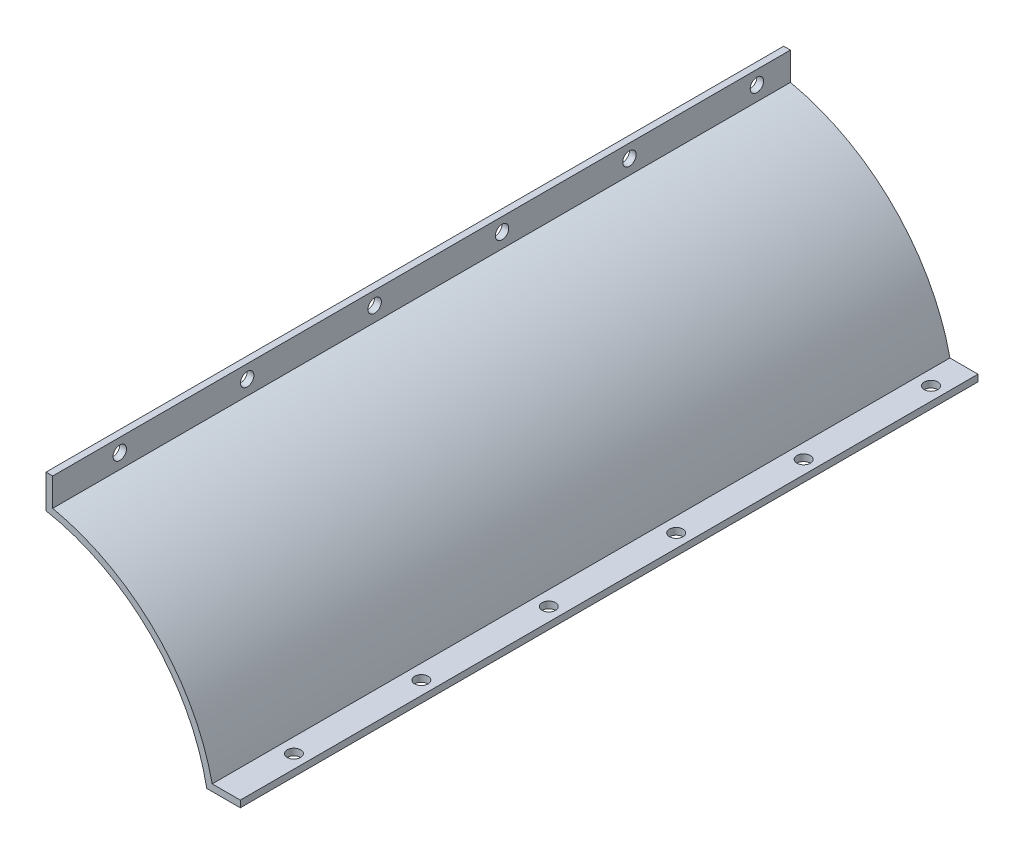
ISO-10303-21;
HEADER;
FILE_DESCRIPTION(('STEP AP214'),'2;1');
FILE_NAME('part.step','',(''),(''),'','','');
FILE_SCHEMA(('AUTOMOTIVE_DESIGN { 1 0 10303 214 1 1 1 1 }'));
ENDSEC;
DATA;
#1=APPLICATION_CONTEXT('core data for automotive mechanical design processes');
#2=APPLICATION_PROTOCOL_DEFINITION('international standard','automotive_design',2000,#1);
#3=PRODUCT_CONTEXT('',#1,'mechanical');
#4=PRODUCT('Part','Part','',(#3));
#5=PRODUCT_RELATED_PRODUCT_CATEGORY('part','',(#4));
#6=PRODUCT_DEFINITION_FORMATION('','',#4);
#7=PRODUCT_DEFINITION_CONTEXT('part definition',#1,'design');
#8=PRODUCT_DEFINITION('design','',#6,#7);
#9=PRODUCT_DEFINITION_SHAPE('','',#8);
#10=(LENGTH_UNIT() NAMED_UNIT(*) SI_UNIT(.MILLI.,.METRE.));
#11=(NAMED_UNIT(*) PLANE_ANGLE_UNIT() SI_UNIT($,.RADIAN.));
#12=(NAMED_UNIT(*) SI_UNIT($,.STERADIAN.) SOLID_ANGLE_UNIT());
#13=UNCERTAINTY_MEASURE_WITH_UNIT(LENGTH_MEASURE(1.E-05),#10,'distance_accuracy_value','');
#14=(GEOMETRIC_REPRESENTATION_CONTEXT(3) GLOBAL_UNCERTAINTY_ASSIGNED_CONTEXT((#13)) GLOBAL_UNIT_ASSIGNED_CONTEXT((#10,
#11,#12)) REPRESENTATION_CONTEXT('',''));
#15=CARTESIAN_POINT('',(0.,0.,0.));
#16=DIRECTION('',(0.,0.,1.));
#17=DIRECTION('',(1.,0.,0.));
#18=AXIS2_PLACEMENT_3D('',#15,#16,#17);
#19=CARTESIAN_POINT('',(0.,16.8155602251023,279.4));
#20=DIRECTION('',(0.,1.,0.));
#21=DIRECTION('',(-1.,0.,0.));
#22=AXIS2_PLACEMENT_3D('',#19,#20,#21);
#23=PLANE('',#22);
#24=CARTESIAN_POINT('',(82.4708408787736,16.8155602251023,12.7));
#25=DIRECTION('',(0.,1.,0.));
#26=DIRECTION('',(-1.,0.,0.));
#27=AXIS2_PLACEMENT_3D('',#24,#25,#26);
#28=CIRCLE('',#27,2.54);
#29=CARTESIAN_POINT('',(79.9308408787736,16.8155602251023,12.7));
#30=VERTEX_POINT('',#29);
#31=EDGE_CURVE('E246',#30,#30,#28,.T.);
#32=ORIENTED_EDGE('',*,*,#31,.F.);
#33=EDGE_LOOP('',(#32));
#34=FACE_BOUND('',#33,.T.);
#35=CARTESIAN_POINT('',(82.4708408787734,16.8155602251023,60.96));
#36=DIRECTION('',(0.,1.,0.));
#37=DIRECTION('',(-1.,0.,0.));
#38=AXIS2_PLACEMENT_3D('',#35,#36,#37);
#39=CIRCLE('',#38,2.54);
#40=CARTESIAN_POINT('',(79.9308408787734,16.8155602251023,60.96));
#41=VERTEX_POINT('',#40);
#42=EDGE_CURVE('E250',#41,#41,#39,.T.);
#43=ORIENTED_EDGE('',*,*,#42,.F.);
#44=EDGE_LOOP('',(#43));
#45=FACE_BOUND('',#44,.T.);
#46=CARTESIAN_POINT('',(82.4708408787732,16.8155602251023,109.22));
#47=DIRECTION('',(0.,1.,0.));
#48=DIRECTION('',(-1.,0.,0.));
#49=AXIS2_PLACEMENT_3D('',#46,#47,#48);
#50=CIRCLE('',#49,2.53999999999999);
#51=CARTESIAN_POINT('',(79.9308408787732,16.8155602251023,109.22));
#52=VERTEX_POINT('',#51);
#53=EDGE_CURVE('E254',#52,#52,#50,.T.);
#54=ORIENTED_EDGE('',*,*,#53,.F.);
#55=EDGE_LOOP('',(#54));
#56=FACE_BOUND('',#55,.T.);
#57=CARTESIAN_POINT('',(82.4708408787731,16.8155602251023,157.48));
#58=DIRECTION('',(0.,1.,0.));
#59=DIRECTION('',(-1.,0.,0.));
#60=AXIS2_PLACEMENT_3D('',#57,#58,#59);
#61=CIRCLE('',#60,2.54);
#62=CARTESIAN_POINT('',(79.9308408787731,16.8155602251023,157.48));
#63=VERTEX_POINT('',#62);
#64=EDGE_CURVE('E258',#63,#63,#61,.T.);
#65=ORIENTED_EDGE('',*,*,#64,.F.);
#66=EDGE_LOOP('',(#65));
#67=FACE_BOUND('',#66,.T.);
#68=CARTESIAN_POINT('',(82.4708408787729,16.8155602251023,205.74));
#69=DIRECTION('',(0.,1.,0.));
#70=DIRECTION('',(-1.,0.,0.));
#71=AXIS2_PLACEMENT_3D('',#68,#69,#70);
#72=CIRCLE('',#71,2.54);
#73=CARTESIAN_POINT('',(79.9308408787729,16.8155602251023,205.74));
#74=VERTEX_POINT('',#73);
#75=EDGE_CURVE('E262',#74,#74,#72,.T.);
#76=ORIENTED_EDGE('',*,*,#75,.F.);
#77=EDGE_LOOP('',(#76));
#78=FACE_BOUND('',#77,.T.);
#79=CARTESIAN_POINT('',(82.4708408787727,16.8155602251023,254.));
#80=DIRECTION('',(0.,1.,0.));
#81=DIRECTION('',(-1.,0.,0.));
#82=AXIS2_PLACEMENT_3D('',#79,#80,#81);
#83=CIRCLE('',#82,2.53999999999998);
#84=CARTESIAN_POINT('',(79.9308408787727,16.8155602251023,254.));
#85=VERTEX_POINT('',#84);
#86=EDGE_CURVE('E265',#85,#85,#83,.T.);
#87=ORIENTED_EDGE('',*,*,#86,.F.);
#88=EDGE_LOOP('',(#87));
#89=FACE_BOUND('',#88,.T.);
#90=DIRECTION('',(1.,0.,0.));
#91=VECTOR('',#90,1.);
#92=CARTESIAN_POINT('',(0.,16.8155602251023,0.));
#93=LINE('',#92,#91);
#94=CARTESIAN_POINT('',(76.9234979334401,16.8155602251023,0.));
#95=VERTEX_POINT('',#94);
#96=CARTESIAN_POINT('',(87.5508408787736,16.8155602251023,0.));
#97=VERTEX_POINT('',#96);
#98=EDGE_CURVE('E148',#95,#97,#93,.T.);
#99=ORIENTED_EDGE('',*,*,#98,.F.);
#100=DIRECTION('',(0.,0.,-1.));
#101=VECTOR('',#100,1.);
#102=CARTESIAN_POINT('',(76.9234979334401,16.8155602251023,279.4));
#103=LINE('',#102,#101);
#104=CARTESIAN_POINT('',(76.9234979334401,16.8155602251023,279.4));
#105=VERTEX_POINT('',#104);
#106=EDGE_CURVE('E11',#105,#95,#103,.T.);
#107=ORIENTED_EDGE('',*,*,#106,.F.);
#108=DIRECTION('',(1.,0.,0.));
#109=VECTOR('',#108,1.);
#110=CARTESIAN_POINT('',(0.,16.8155602251023,279.4));
#111=LINE('',#110,#109);
#112=CARTESIAN_POINT('',(87.5508408787736,16.8155602251023,279.4));
#113=VERTEX_POINT('',#112);
#114=EDGE_CURVE('E175',#105,#113,#111,.T.);
#115=ORIENTED_EDGE('',*,*,#114,.T.);
#116=DIRECTION('',(0.,0.,-1.));
#117=VECTOR('',#116,1.);
#118=CARTESIAN_POINT('',(87.5508408787736,16.8155602251023,279.4));
#119=LINE('',#118,#117);
#120=EDGE_CURVE('E64',#113,#97,#119,.T.);
#121=ORIENTED_EDGE('',*,*,#120,.T.);
#122=EDGE_LOOP('',(#99,#107,#115,#121));
#123=FACE_BOUND('',#122,.T.);
#124=ADVANCED_FACE('F45',(#34,#45,#56,#67,#78,#89,#123),#23,.T.);
#125=CARTESIAN_POINT('',(0.,0.,279.4));
#126=DIRECTION('',(0.,0.,-1.));
#127=DIRECTION('',(-1.,0.,0.));
#128=AXIS2_PLACEMENT_3D('',#125,#126,#127);
#129=CYLINDRICAL_SURFACE('',#128,78.74);
#130=CARTESIAN_POINT('',(0.,0.,0.));
#131=DIRECTION('',(0.,0.,1.));
#132=DIRECTION('',(1.,0.,0.));
#133=AXIS2_PLACEMENT_3D('',#130,#131,#132);
#134=CIRCLE('',#133,78.74);
#135=CARTESIAN_POINT('',(16.51,76.9896583964366,0.));
#136=VERTEX_POINT('',#135);
#137=EDGE_CURVE('E151',#95,#136,#134,.T.);
#138=ORIENTED_EDGE('',*,*,#137,.T.);
#139=DIRECTION('',(0.,0.,-1.));
#140=VECTOR('',#139,1.);
#141=CARTESIAN_POINT('',(16.51,76.9896583964366,279.4));
#142=LINE('',#141,#140);
#143=CARTESIAN_POINT('',(16.51,76.9896583964366,279.4));
#144=VERTEX_POINT('',#143);
#145=EDGE_CURVE('E55',#144,#136,#142,.T.);
#146=ORIENTED_EDGE('',*,*,#145,.F.);
#147=CARTESIAN_POINT('',(0.,0.,279.4));
#148=DIRECTION('',(0.,0.,1.));
#149=DIRECTION('',(1.,0.,0.));
#150=AXIS2_PLACEMENT_3D('',#147,#148,#149);
#151=CIRCLE('',#150,78.74);
#152=EDGE_CURVE('E326',#105,#144,#151,.T.);
#153=ORIENTED_EDGE('',*,*,#152,.F.);
#154=ORIENTED_EDGE('',*,*,#106,.T.);
#155=EDGE_LOOP('',(#138,#146,#153,#154));
#156=FACE_BOUND('',#155,.T.);
#157=ADVANCED_FACE('F236',(#156),#129,.T.);
#158=CARTESIAN_POINT('',(16.51,0.,279.4));
#159=DIRECTION('',(1.,0.,0.));
#160=DIRECTION('',(0.,0.,-1.));
#161=AXIS2_PLACEMENT_3D('',#158,#159,#160);
#162=PLANE('',#161);
#163=CARTESIAN_POINT('',(16.51,82.5284714835378,12.7));
#164=DIRECTION('',(1.,0.,0.));
#165=DIRECTION('',(0.,0.,-1.));
#166=AXIS2_PLACEMENT_3D('',#163,#164,#165);
#167=CIRCLE('',#166,2.53999999999999);
#168=CARTESIAN_POINT('',(16.51,82.5284714835378,10.16));
#169=VERTEX_POINT('',#168);
#170=EDGE_CURVE('E196',#169,#169,#167,.T.);
#171=ORIENTED_EDGE('',*,*,#170,.F.);
#172=EDGE_LOOP('',(#171));
#173=FACE_BOUND('',#172,.T.);
#174=CARTESIAN_POINT('',(16.51,82.5284714835375,60.96));
#175=DIRECTION('',(1.,0.,0.));
#176=DIRECTION('',(0.,0.,-1.));
#177=AXIS2_PLACEMENT_3D('',#174,#175,#176);
#178=CIRCLE('',#177,2.53999999999999);
#179=CARTESIAN_POINT('',(16.51,82.5284714835375,58.42));
#180=VERTEX_POINT('',#179);
#181=EDGE_CURVE('E298',#180,#180,#178,.T.);
#182=ORIENTED_EDGE('',*,*,#181,.F.);
#183=EDGE_LOOP('',(#182));
#184=FACE_BOUND('',#183,.T.);
#185=CARTESIAN_POINT('',(16.51,82.5284714835372,109.22));
#186=DIRECTION('',(1.,0.,0.));
#187=DIRECTION('',(0.,0.,-1.));
#188=AXIS2_PLACEMENT_3D('',#185,#186,#187);
#189=CIRCLE('',#188,2.53999999999999);
#190=CARTESIAN_POINT('',(16.51,82.5284714835372,106.68));
#191=VERTEX_POINT('',#190);
#192=EDGE_CURVE('E302',#191,#191,#189,.T.);
#193=ORIENTED_EDGE('',*,*,#192,.F.);
#194=EDGE_LOOP('',(#193));
#195=FACE_BOUND('',#194,.T.);
#196=CARTESIAN_POINT('',(16.51,82.5284714835368,157.48));
#197=DIRECTION('',(1.,0.,0.));
#198=DIRECTION('',(0.,0.,-1.));
#199=AXIS2_PLACEMENT_3D('',#196,#197,#198);
#200=CIRCLE('',#199,2.53999999999998);
#201=CARTESIAN_POINT('',(16.51,82.5284714835368,154.94));
#202=VERTEX_POINT('',#201);
#203=EDGE_CURVE('E306',#202,#202,#200,.T.);
#204=ORIENTED_EDGE('',*,*,#203,.F.);
#205=EDGE_LOOP('',(#204));
#206=FACE_BOUND('',#205,.T.);
#207=CARTESIAN_POINT('',(16.51,82.5284714835365,205.74));
#208=DIRECTION('',(1.,0.,0.));
#209=DIRECTION('',(0.,0.,-1.));
#210=AXIS2_PLACEMENT_3D('',#207,#208,#209);
#211=CIRCLE('',#210,2.53999999999998);
#212=CARTESIAN_POINT('',(16.51,82.5284714835365,203.2));
#213=VERTEX_POINT('',#212);
#214=EDGE_CURVE('E310',#213,#213,#211,.T.);
#215=ORIENTED_EDGE('',*,*,#214,.F.);
#216=EDGE_LOOP('',(#215));
#217=FACE_BOUND('',#216,.T.);
#218=CARTESIAN_POINT('',(16.51,82.5284714835362,254.));
#219=DIRECTION('',(1.,0.,0.));
#220=DIRECTION('',(0.,0.,-1.));
#221=AXIS2_PLACEMENT_3D('',#218,#219,#220);
#222=CIRCLE('',#221,2.54000000000001);
#223=CARTESIAN_POINT('',(16.51,82.5284714835362,251.46));
#224=VERTEX_POINT('',#223);
#225=EDGE_CURVE('E314',#224,#224,#222,.T.);
#226=ORIENTED_EDGE('',*,*,#225,.F.);
#227=EDGE_LOOP('',(#226));
#228=FACE_BOUND('',#227,.T.);
#229=DIRECTION('',(0.,-1.,0.));
#230=VECTOR('',#229,1.);
#231=CARTESIAN_POINT('',(16.51,0.,0.));
#232=LINE('',#231,#230);
#233=CARTESIAN_POINT('',(16.51,87.6084714835378,0.));
#234=VERTEX_POINT('',#233);
#235=EDGE_CURVE('E155',#234,#136,#232,.T.);
#236=ORIENTED_EDGE('',*,*,#235,.F.);
#237=DIRECTION('',(0.,0.,-1.));
#238=VECTOR('',#237,1.);
#239=CARTESIAN_POINT('',(16.51,87.6084714835378,279.4));
#240=LINE('',#239,#238);
#241=CARTESIAN_POINT('',(16.51,87.6084714835378,279.4));
#242=VERTEX_POINT('',#241);
#243=EDGE_CURVE('E186',#242,#234,#240,.T.);
#244=ORIENTED_EDGE('',*,*,#243,.F.);
#245=DIRECTION('',(0.,-1.,0.));
#246=VECTOR('',#245,1.);
#247=CARTESIAN_POINT('',(16.51,0.,279.4));
#248=LINE('',#247,#246);
#249=EDGE_CURVE('E325',#242,#144,#248,.T.);
#250=ORIENTED_EDGE('',*,*,#249,.T.);
#251=ORIENTED_EDGE('',*,*,#145,.T.);
#252=EDGE_LOOP('',(#236,#244,#250,#251));
#253=FACE_BOUND('',#252,.T.);
#254=ADVANCED_FACE('F241',(#173,#184,#195,#206,#217,#228,#253),#162,.T.);
#255=CARTESIAN_POINT('',(0.,87.6084714835378,279.4));
#256=DIRECTION('',(0.,-1.,0.));
#257=DIRECTION('',(0.,0.,-1.));
#258=AXIS2_PLACEMENT_3D('',#255,#256,#257);
#259=PLANE('',#258);
#260=DIRECTION('',(-1.,0.,0.));
#261=VECTOR('',#260,1.);
#262=CARTESIAN_POINT('',(0.,87.6084714835378,0.));
#263=LINE('',#262,#261);
#264=CARTESIAN_POINT('',(13.97,87.6084714835378,0.));
#265=VERTEX_POINT('',#264);
#266=EDGE_CURVE('E159',#234,#265,#263,.T.);
#267=ORIENTED_EDGE('',*,*,#266,.T.);
#268=DIRECTION('',(0.,0.,-1.));
#269=VECTOR('',#268,1.);
#270=CARTESIAN_POINT('',(13.97,87.6084714835378,279.4));
#271=LINE('',#270,#269);
#272=CARTESIAN_POINT('',(13.97,87.6084714835378,279.4));
#273=VERTEX_POINT('',#272);
#274=EDGE_CURVE('E182',#273,#265,#271,.T.);
#275=ORIENTED_EDGE('',*,*,#274,.F.);
#276=DIRECTION('',(-1.,0.,0.));
#277=VECTOR('',#276,1.);
#278=CARTESIAN_POINT('',(0.,87.6084714835378,279.4));
#279=LINE('',#278,#277);
#280=EDGE_CURVE('E142',#242,#273,#279,.T.);
#281=ORIENTED_EDGE('',*,*,#280,.F.);
#282=ORIENTED_EDGE('',*,*,#243,.T.);
#283=EDGE_LOOP('',(#267,#275,#281,#282));
#284=FACE_BOUND('',#283,.T.);
#285=ADVANCED_FACE('F285',(#284),#259,.F.);
#286=CARTESIAN_POINT('',(13.97,0.,279.4));
#287=DIRECTION('',(1.,0.,0.));
#288=DIRECTION('',(0.,0.,-1.));
#289=AXIS2_PLACEMENT_3D('',#286,#287,#288);
#290=PLANE('',#289);
#291=CARTESIAN_POINT('',(13.97,82.5284714835378,12.7));
#292=DIRECTION('',(1.,0.,0.));
#293=DIRECTION('',(0.,0.,-1.));
#294=AXIS2_PLACEMENT_3D('',#291,#292,#293);
#295=CIRCLE('',#294,2.53999999999999);
#296=CARTESIAN_POINT('',(13.97,82.5284714835378,10.16));
#297=VERTEX_POINT('',#296);
#298=EDGE_CURVE('E48',#297,#297,#295,.T.);
#299=ORIENTED_EDGE('',*,*,#298,.T.);
#300=EDGE_LOOP('',(#299));
#301=FACE_BOUND('',#300,.T.);
#302=CARTESIAN_POINT('',(13.97,82.5284714835375,60.96));
#303=DIRECTION('',(1.,0.,0.));
#304=DIRECTION('',(0.,0.,-1.));
#305=AXIS2_PLACEMENT_3D('',#302,#303,#304);
#306=CIRCLE('',#305,2.53999999999999);
#307=CARTESIAN_POINT('',(13.97,82.5284714835375,58.42));
#308=VERTEX_POINT('',#307);
#309=EDGE_CURVE('E207',#308,#308,#306,.T.);
#310=ORIENTED_EDGE('',*,*,#309,.T.);
#311=EDGE_LOOP('',(#310));
#312=FACE_BOUND('',#311,.T.);
#313=CARTESIAN_POINT('',(13.97,82.5284714835372,109.22));
#314=DIRECTION('',(1.,0.,0.));
#315=DIRECTION('',(0.,0.,-1.));
#316=AXIS2_PLACEMENT_3D('',#313,#314,#315);
#317=CIRCLE('',#316,2.53999999999999);
#318=CARTESIAN_POINT('',(13.97,82.5284714835372,106.68));
#319=VERTEX_POINT('',#318);
#320=EDGE_CURVE('E204',#319,#319,#317,.T.);
#321=ORIENTED_EDGE('',*,*,#320,.T.);
#322=EDGE_LOOP('',(#321));
#323=FACE_BOUND('',#322,.T.);
#324=CARTESIAN_POINT('',(13.97,82.5284714835368,157.48));
#325=DIRECTION('',(1.,0.,0.));
#326=DIRECTION('',(0.,0.,-1.));
#327=AXIS2_PLACEMENT_3D('',#324,#325,#326);
#328=CIRCLE('',#327,2.53999999999998);
#329=CARTESIAN_POINT('',(13.97,82.5284714835368,154.94));
#330=VERTEX_POINT('',#329);
#331=EDGE_CURVE('E200',#330,#330,#328,.T.);
#332=ORIENTED_EDGE('',*,*,#331,.T.);
#333=EDGE_LOOP('',(#332));
#334=FACE_BOUND('',#333,.T.);
#335=CARTESIAN_POINT('',(13.97,82.5284714835365,205.74));
#336=DIRECTION('',(1.,0.,0.));
#337=DIRECTION('',(0.,0.,-1.));
#338=AXIS2_PLACEMENT_3D('',#335,#336,#337);
#339=CIRCLE('',#338,2.53999999999998);
#340=CARTESIAN_POINT('',(13.97,82.5284714835365,203.2));
#341=VERTEX_POINT('',#340);
#342=EDGE_CURVE('E195',#341,#341,#339,.T.);
#343=ORIENTED_EDGE('',*,*,#342,.T.);
#344=EDGE_LOOP('',(#343));
#345=FACE_BOUND('',#344,.T.);
#346=CARTESIAN_POINT('',(13.97,82.5284714835362,254.));
#347=DIRECTION('',(1.,0.,0.));
#348=DIRECTION('',(0.,0.,-1.));
#349=AXIS2_PLACEMENT_3D('',#346,#347,#348);
#350=CIRCLE('',#349,2.54000000000001);
#351=CARTESIAN_POINT('',(13.97,82.5284714835362,251.46));
#352=VERTEX_POINT('',#351);
#353=EDGE_CURVE('E191',#352,#352,#350,.T.);
#354=ORIENTED_EDGE('',*,*,#353,.T.);
#355=EDGE_LOOP('',(#354));
#356=FACE_BOUND('',#355,.T.);
#357=DIRECTION('',(0.,-1.,0.));
#358=VECTOR('',#357,1.);
#359=CARTESIAN_POINT('',(13.97,0.,0.));
#360=LINE('',#359,#358);
#361=CARTESIAN_POINT('',(13.97,74.9084714835378,0.));
#362=VERTEX_POINT('',#361);
#363=EDGE_CURVE('E162',#265,#362,#360,.T.);
#364=ORIENTED_EDGE('',*,*,#363,.T.);
#365=DIRECTION('',(0.,0.,-1.));
#366=VECTOR('',#365,1.);
#367=CARTESIAN_POINT('',(13.97,74.9084714835378,279.4));
#368=LINE('',#367,#366);
#369=CARTESIAN_POINT('',(13.97,74.9084714835378,279.4));
#370=VERTEX_POINT('',#369);
#371=EDGE_CURVE('E125',#370,#362,#368,.T.);
#372=ORIENTED_EDGE('',*,*,#371,.F.);
#373=DIRECTION('',(0.,-1.,0.));
#374=VECTOR('',#373,1.);
#375=CARTESIAN_POINT('',(13.97,0.,279.4));
#376=LINE('',#375,#374);
#377=EDGE_CURVE('E137',#273,#370,#376,.T.);
#378=ORIENTED_EDGE('',*,*,#377,.F.);
#379=ORIENTED_EDGE('',*,*,#274,.T.);
#380=EDGE_LOOP('',(#364,#372,#378,#379));
#381=FACE_BOUND('',#380,.T.);
#382=ADVANCED_FACE('F216',(#301,#312,#323,#334,#345,#356,#381),#290,.F.);
#383=CARTESIAN_POINT('',(0.,0.,279.4));
#384=DIRECTION('',(0.,0.,-1.));
#385=DIRECTION('',(-1.,0.,0.));
#386=AXIS2_PLACEMENT_3D('',#383,#384,#385);
#387=CYLINDRICAL_SURFACE('',#386,76.2);
#388=CARTESIAN_POINT('',(0.,0.,0.));
#389=DIRECTION('',(0.,0.,1.));
#390=DIRECTION('',(1.,0.,0.));
#391=AXIS2_PLACEMENT_3D('',#388,#389,#390);
#392=CIRCLE('',#391,76.2);
#393=CARTESIAN_POINT('',(74.8508408787736,14.2755602251023,0.));
#394=VERTEX_POINT('',#393);
#395=EDGE_CURVE('E121',#394,#362,#392,.T.);
#396=ORIENTED_EDGE('',*,*,#395,.F.);
#397=DIRECTION('',(0.,0.,-1.));
#398=VECTOR('',#397,1.);
#399=CARTESIAN_POINT('',(74.8508408787736,14.2755602251023,279.4));
#400=LINE('',#399,#398);
#401=CARTESIAN_POINT('',(74.8508408787736,14.2755602251023,279.4));
#402=VERTEX_POINT('',#401);
#403=EDGE_CURVE('E115',#402,#394,#400,.T.);
#404=ORIENTED_EDGE('',*,*,#403,.F.);
#405=CARTESIAN_POINT('',(0.,0.,279.4));
#406=DIRECTION('',(0.,0.,1.));
#407=DIRECTION('',(1.,0.,0.));
#408=AXIS2_PLACEMENT_3D('',#405,#406,#407);
#409=CIRCLE('',#408,76.2);
#410=EDGE_CURVE('E119',#402,#370,#409,.T.);
#411=ORIENTED_EDGE('',*,*,#410,.T.);
#412=ORIENTED_EDGE('',*,*,#371,.T.);
#413=EDGE_LOOP('',(#396,#404,#411,#412));
#414=FACE_BOUND('',#413,.T.);
#415=ADVANCED_FACE('F117',(#414),#387,.F.);
#416=CARTESIAN_POINT('',(0.,14.2755602251023,279.4));
#417=DIRECTION('',(0.,1.,0.));
#418=DIRECTION('',(-1.,0.,0.));
#419=AXIS2_PLACEMENT_3D('',#416,#417,#418);
#420=PLANE('',#419);
#421=CARTESIAN_POINT('',(82.4708408787736,14.2755602251023,12.7));
#422=DIRECTION('',(0.,-1.,0.));
#423=DIRECTION('',(1.,0.,0.));
#424=AXIS2_PLACEMENT_3D('',#421,#422,#423);
#425=CIRCLE('',#424,2.54);
#426=CARTESIAN_POINT('',(85.0108408787736,14.2755602251023,12.7));
#427=VERTEX_POINT('',#426);
#428=EDGE_CURVE('E358',#427,#427,#425,.T.);
#429=ORIENTED_EDGE('',*,*,#428,.F.);
#430=EDGE_LOOP('',(#429));
#431=FACE_BOUND('',#430,.T.);
#432=CARTESIAN_POINT('',(82.4708408787734,14.2755602251023,60.96));
#433=DIRECTION('',(0.,-1.,0.));
#434=DIRECTION('',(1.,0.,0.));
#435=AXIS2_PLACEMENT_3D('',#432,#433,#434);
#436=CIRCLE('',#435,2.54);
#437=CARTESIAN_POINT('',(85.0108408787734,14.2755602251023,60.96));
#438=VERTEX_POINT('',#437);
#439=EDGE_CURVE('E375',#438,#438,#436,.T.);
#440=ORIENTED_EDGE('',*,*,#439,.F.);
#441=EDGE_LOOP('',(#440));
#442=FACE_BOUND('',#441,.T.);
#443=CARTESIAN_POINT('',(82.4708408787732,14.2755602251023,109.22));
#444=DIRECTION('',(0.,-1.,0.));
#445=DIRECTION('',(1.,0.,0.));
#446=AXIS2_PLACEMENT_3D('',#443,#444,#445);
#447=CIRCLE('',#446,2.53999999999999);
#448=CARTESIAN_POINT('',(85.0108408787732,14.2755602251023,109.22));
#449=VERTEX_POINT('',#448);
#450=EDGE_CURVE('E371',#449,#449,#447,.T.);
#451=ORIENTED_EDGE('',*,*,#450,.F.);
#452=EDGE_LOOP('',(#451));
#453=FACE_BOUND('',#452,.T.);
#454=CARTESIAN_POINT('',(82.4708408787731,14.2755602251023,157.48));
#455=DIRECTION('',(0.,-1.,0.));
#456=DIRECTION('',(1.,0.,0.));
#457=AXIS2_PLACEMENT_3D('',#454,#455,#456);
#458=CIRCLE('',#457,2.54);
#459=CARTESIAN_POINT('',(85.0108408787731,14.2755602251023,157.48));
#460=VERTEX_POINT('',#459);
#461=EDGE_CURVE('E367',#460,#460,#458,.T.);
#462=ORIENTED_EDGE('',*,*,#461,.F.);
#463=EDGE_LOOP('',(#462));
#464=FACE_BOUND('',#463,.T.);
#465=CARTESIAN_POINT('',(82.4708408787729,14.2755602251023,205.74));
#466=DIRECTION('',(0.,-1.,0.));
#467=DIRECTION('',(1.,0.,0.));
#468=AXIS2_PLACEMENT_3D('',#465,#466,#467);
#469=CIRCLE('',#468,2.54);
#470=CARTESIAN_POINT('',(85.0108408787729,14.2755602251023,205.74));
#471=VERTEX_POINT('',#470);
#472=EDGE_CURVE('E363',#471,#471,#469,.T.);
#473=ORIENTED_EDGE('',*,*,#472,.F.);
#474=EDGE_LOOP('',(#473));
#475=FACE_BOUND('',#474,.T.);
#476=CARTESIAN_POINT('',(82.4708408787727,14.2755602251023,254.));
#477=DIRECTION('',(0.,-1.,0.));
#478=DIRECTION('',(1.,0.,0.));
#479=AXIS2_PLACEMENT_3D('',#476,#477,#478);
#480=CIRCLE('',#479,2.53999999999998);
#481=CARTESIAN_POINT('',(85.0108408787727,14.2755602251023,254.));
#482=VERTEX_POINT('',#481);
#483=EDGE_CURVE('E359',#482,#482,#480,.T.);
#484=ORIENTED_EDGE('',*,*,#483,.F.);
#485=EDGE_LOOP('',(#484));
#486=FACE_BOUND('',#485,.T.);
#487=DIRECTION('',(1.,0.,0.));
#488=VECTOR('',#487,1.);
#489=CARTESIAN_POINT('',(0.,14.2755602251023,0.));
#490=LINE('',#489,#488);
#491=CARTESIAN_POINT('',(87.5508408787736,14.2755602251023,0.));
#492=VERTEX_POINT('',#491);
#493=EDGE_CURVE('E168',#394,#492,#490,.T.);
#494=ORIENTED_EDGE('',*,*,#493,.T.);
#495=DIRECTION('',(0.,0.,-1.));
#496=VECTOR('',#495,1.);
#497=CARTESIAN_POINT('',(87.5508408787736,14.2755602251023,279.4));
#498=LINE('',#497,#496);
#499=CARTESIAN_POINT('',(87.5508408787736,14.2755602251023,279.4));
#500=VERTEX_POINT('',#499);
#501=EDGE_CURVE('E90',#500,#492,#498,.T.);
#502=ORIENTED_EDGE('',*,*,#501,.F.);
#503=DIRECTION('',(1.,0.,0.));
#504=VECTOR('',#503,1.);
#505=CARTESIAN_POINT('',(0.,14.2755602251023,279.4));
#506=LINE('',#505,#504);
#507=EDGE_CURVE('E127',#402,#500,#506,.T.);
#508=ORIENTED_EDGE('',*,*,#507,.F.);
#509=ORIENTED_EDGE('',*,*,#403,.T.);
#510=EDGE_LOOP('',(#494,#502,#508,#509));
#511=FACE_BOUND('',#510,.T.);
#512=ADVANCED_FACE('F128',(#431,#442,#453,#464,#475,#486,#511),#420,.F.);
#513=CARTESIAN_POINT('',(87.5508408787736,0.,279.4));
#514=DIRECTION('',(1.,0.,0.));
#515=DIRECTION('',(0.,0.,-1.));
#516=AXIS2_PLACEMENT_3D('',#513,#514,#515);
#517=PLANE('',#516);
#518=DIRECTION('',(0.,-1.,0.));
#519=VECTOR('',#518,1.);
#520=CARTESIAN_POINT('',(87.5508408787736,0.,0.));
#521=LINE('',#520,#519);
#522=EDGE_CURVE('E171',#97,#492,#521,.T.);
#523=ORIENTED_EDGE('',*,*,#522,.F.);
#524=ORIENTED_EDGE('',*,*,#120,.F.);
#525=DIRECTION('',(0.,-1.,0.));
#526=VECTOR('',#525,1.);
#527=CARTESIAN_POINT('',(87.5508408787736,0.,279.4));
#528=LINE('',#527,#526);
#529=EDGE_CURVE('E132',#113,#500,#528,.T.);
#530=ORIENTED_EDGE('',*,*,#529,.T.);
#531=ORIENTED_EDGE('',*,*,#501,.T.);
#532=EDGE_LOOP('',(#523,#524,#530,#531));
#533=FACE_BOUND('',#532,.T.);
#534=ADVANCED_FACE('F269',(#533),#517,.T.);
#535=CARTESIAN_POINT('',(0.,0.,279.4));
#536=DIRECTION('',(0.,0.,1.));
#537=DIRECTION('',(1.,0.,0.));
#538=AXIS2_PLACEMENT_3D('',#535,#536,#537);
#539=PLANE('',#538);
#540=ORIENTED_EDGE('',*,*,#114,.F.);
#541=ORIENTED_EDGE('',*,*,#152,.T.);
#542=ORIENTED_EDGE('',*,*,#249,.F.);
#543=ORIENTED_EDGE('',*,*,#280,.T.);
#544=ORIENTED_EDGE('',*,*,#377,.T.);
#545=ORIENTED_EDGE('',*,*,#410,.F.);
#546=ORIENTED_EDGE('',*,*,#507,.T.);
#547=ORIENTED_EDGE('',*,*,#529,.F.);
#548=EDGE_LOOP('',(#540,#541,#542,#543,#544,#545,#546,#547));
#549=FACE_BOUND('',#548,.T.);
#550=ADVANCED_FACE('F135',(#549),#539,.T.);
#551=CARTESIAN_POINT('',(0.,0.,0.));
#552=DIRECTION('',(0.,0.,1.));
#553=DIRECTION('',(1.,0.,0.));
#554=AXIS2_PLACEMENT_3D('',#551,#552,#553);
#555=PLANE('',#554);
#556=ORIENTED_EDGE('',*,*,#98,.T.);
#557=ORIENTED_EDGE('',*,*,#522,.T.);
#558=ORIENTED_EDGE('',*,*,#493,.F.);
#559=ORIENTED_EDGE('',*,*,#395,.T.);
#560=ORIENTED_EDGE('',*,*,#363,.F.);
#561=ORIENTED_EDGE('',*,*,#266,.F.);
#562=ORIENTED_EDGE('',*,*,#235,.T.);
#563=ORIENTED_EDGE('',*,*,#137,.F.);
#564=EDGE_LOOP('',(#556,#557,#558,#559,#560,#561,#562,#563));
#565=FACE_BOUND('',#564,.T.);
#566=ADVANCED_FACE('F268',(#565),#555,.F.);
#567=CARTESIAN_POINT('',(-262.89,82.5284714835362,254.));
#568=DIRECTION('',(1.,0.,0.));
#569=DIRECTION('',(0.,0.,-1.));
#570=AXIS2_PLACEMENT_3D('',#567,#568,#569);
#571=CYLINDRICAL_SURFACE('',#570,2.54000000000001);
#572=ORIENTED_EDGE('',*,*,#225,.T.);
#573=EDGE_LOOP('',(#572));
#574=FACE_BOUND('',#573,.T.);
#575=ORIENTED_EDGE('',*,*,#353,.F.);
#576=EDGE_LOOP('',(#575));
#577=FACE_BOUND('',#576,.T.);
#578=ADVANCED_FACE('F501',(#574,#577),#571,.F.);
#579=CARTESIAN_POINT('',(-262.89,82.5284714835365,205.74));
#580=DIRECTION('',(1.,0.,0.));
#581=DIRECTION('',(0.,0.,-1.));
#582=AXIS2_PLACEMENT_3D('',#579,#580,#581);
#583=CYLINDRICAL_SURFACE('',#582,2.53999999999998);
#584=ORIENTED_EDGE('',*,*,#214,.T.);
#585=EDGE_LOOP('',(#584));
#586=FACE_BOUND('',#585,.T.);
#587=ORIENTED_EDGE('',*,*,#342,.F.);
#588=EDGE_LOOP('',(#587));
#589=FACE_BOUND('',#588,.T.);
#590=ADVANCED_FACE('F490',(#586,#589),#583,.F.);
#591=CARTESIAN_POINT('',(-262.89,82.5284714835368,157.48));
#592=DIRECTION('',(1.,0.,0.));
#593=DIRECTION('',(0.,0.,-1.));
#594=AXIS2_PLACEMENT_3D('',#591,#592,#593);
#595=CYLINDRICAL_SURFACE('',#594,2.53999999999998);
#596=ORIENTED_EDGE('',*,*,#203,.T.);
#597=EDGE_LOOP('',(#596));
#598=FACE_BOUND('',#597,.T.);
#599=ORIENTED_EDGE('',*,*,#331,.F.);
#600=EDGE_LOOP('',(#599));
#601=FACE_BOUND('',#600,.T.);
#602=ADVANCED_FACE('F479',(#598,#601),#595,.F.);
#603=CARTESIAN_POINT('',(-262.89,82.5284714835372,109.22));
#604=DIRECTION('',(1.,0.,0.));
#605=DIRECTION('',(0.,0.,-1.));
#606=AXIS2_PLACEMENT_3D('',#603,#604,#605);
#607=CYLINDRICAL_SURFACE('',#606,2.53999999999999);
#608=ORIENTED_EDGE('',*,*,#192,.T.);
#609=EDGE_LOOP('',(#608));
#610=FACE_BOUND('',#609,.T.);
#611=ORIENTED_EDGE('',*,*,#320,.F.);
#612=EDGE_LOOP('',(#611));
#613=FACE_BOUND('',#612,.T.);
#614=ADVANCED_FACE('F231',(#610,#613),#607,.F.);
#615=CARTESIAN_POINT('',(-262.89,82.5284714835375,60.96));
#616=DIRECTION('',(1.,0.,0.));
#617=DIRECTION('',(0.,0.,-1.));
#618=AXIS2_PLACEMENT_3D('',#615,#616,#617);
#619=CYLINDRICAL_SURFACE('',#618,2.53999999999999);
#620=ORIENTED_EDGE('',*,*,#181,.T.);
#621=EDGE_LOOP('',(#620));
#622=FACE_BOUND('',#621,.T.);
#623=ORIENTED_EDGE('',*,*,#309,.F.);
#624=EDGE_LOOP('',(#623));
#625=FACE_BOUND('',#624,.T.);
#626=ADVANCED_FACE('F221',(#622,#625),#619,.F.);
#627=CARTESIAN_POINT('',(-262.89,82.5284714835378,12.7));
#628=DIRECTION('',(1.,0.,0.));
#629=DIRECTION('',(0.,0.,-1.));
#630=AXIS2_PLACEMENT_3D('',#627,#628,#629);
#631=CYLINDRICAL_SURFACE('',#630,2.53999999999999);
#632=ORIENTED_EDGE('',*,*,#170,.T.);
#633=EDGE_LOOP('',(#632));
#634=FACE_BOUND('',#633,.T.);
#635=ORIENTED_EDGE('',*,*,#298,.F.);
#636=EDGE_LOOP('',(#635));
#637=FACE_BOUND('',#636,.T.);
#638=ADVANCED_FACE('F218',(#634,#637),#631,.F.);
#639=CARTESIAN_POINT('',(82.4708408787727,293.675560225102,254.));
#640=DIRECTION('',(0.,-1.,0.));
#641=DIRECTION('',(1.,0.,0.));
#642=AXIS2_PLACEMENT_3D('',#639,#640,#641);
#643=CYLINDRICAL_SURFACE('',#642,2.53999999999998);
#644=ORIENTED_EDGE('',*,*,#86,.T.);
#645=EDGE_LOOP('',(#644));
#646=FACE_BOUND('',#645,.T.);
#647=ORIENTED_EDGE('',*,*,#483,.T.);
#648=EDGE_LOOP('',(#647));
#649=FACE_BOUND('',#648,.T.);
#650=ADVANCED_FACE('F220',(#646,#649),#643,.F.);
#651=CARTESIAN_POINT('',(82.4708408787728,293.675560225102,205.74));
#652=DIRECTION('',(0.,-1.,0.));
#653=DIRECTION('',(1.,0.,0.));
#654=AXIS2_PLACEMENT_3D('',#651,#652,#653);
#655=CYLINDRICAL_SURFACE('',#654,2.54);
#656=ORIENTED_EDGE('',*,*,#75,.T.);
#657=EDGE_LOOP('',(#656));
#658=FACE_BOUND('',#657,.T.);
#659=ORIENTED_EDGE('',*,*,#472,.T.);
#660=EDGE_LOOP('',(#659));
#661=FACE_BOUND('',#660,.T.);
#662=ADVANCED_FACE('F228',(#658,#661),#655,.F.);
#663=CARTESIAN_POINT('',(82.470840878773,293.675560225102,157.48));
#664=DIRECTION('',(0.,-1.,0.));
#665=DIRECTION('',(1.,0.,0.));
#666=AXIS2_PLACEMENT_3D('',#663,#664,#665);
#667=CYLINDRICAL_SURFACE('',#666,2.54);
#668=ORIENTED_EDGE('',*,*,#64,.T.);
#669=EDGE_LOOP('',(#668));
#670=FACE_BOUND('',#669,.T.);
#671=ORIENTED_EDGE('',*,*,#461,.T.);
#672=EDGE_LOOP('',(#671));
#673=FACE_BOUND('',#672,.T.);
#674=ADVANCED_FACE('F397',(#670,#673),#667,.F.);
#675=CARTESIAN_POINT('',(82.4708408787732,293.675560225102,109.22));
#676=DIRECTION('',(0.,-1.,0.));
#677=DIRECTION('',(1.,0.,0.));
#678=AXIS2_PLACEMENT_3D('',#675,#676,#677);
#679=CYLINDRICAL_SURFACE('',#678,2.53999999999999);
#680=ORIENTED_EDGE('',*,*,#53,.T.);
#681=EDGE_LOOP('',(#680));
#682=FACE_BOUND('',#681,.T.);
#683=ORIENTED_EDGE('',*,*,#450,.T.);
#684=EDGE_LOOP('',(#683));
#685=FACE_BOUND('',#684,.T.);
#686=ADVANCED_FACE('F403',(#682,#685),#679,.F.);
#687=CARTESIAN_POINT('',(82.4708408787733,293.675560225102,60.96));
#688=DIRECTION('',(0.,-1.,0.));
#689=DIRECTION('',(1.,0.,0.));
#690=AXIS2_PLACEMENT_3D('',#687,#688,#689);
#691=CYLINDRICAL_SURFACE('',#690,2.54);
#692=ORIENTED_EDGE('',*,*,#42,.T.);
#693=EDGE_LOOP('',(#692));
#694=FACE_BOUND('',#693,.T.);
#695=ORIENTED_EDGE('',*,*,#439,.T.);
#696=EDGE_LOOP('',(#695));
#697=FACE_BOUND('',#696,.T.);
#698=ADVANCED_FACE('F409',(#694,#697),#691,.F.);
#699=CARTESIAN_POINT('',(82.4708408787735,293.675560225102,12.7));
#700=DIRECTION('',(0.,-1.,0.));
#701=DIRECTION('',(1.,0.,0.));
#702=AXIS2_PLACEMENT_3D('',#699,#700,#701);
#703=CYLINDRICAL_SURFACE('',#702,2.54);
#704=ORIENTED_EDGE('',*,*,#31,.T.);
#705=EDGE_LOOP('',(#704));
#706=FACE_BOUND('',#705,.T.);
#707=ORIENTED_EDGE('',*,*,#428,.T.);
#708=EDGE_LOOP('',(#707));
#709=FACE_BOUND('',#708,.T.);
#710=ADVANCED_FACE('F383',(#706,#709),#703,.F.);
#711=CLOSED_SHELL('',(#124,#157,#254,#285,#382,#415,#512,#534,#550,#566,#578,#590,#602,#614,
#626,#638,#650,#662,#674,#686,#698,#710));
#712=MANIFOLD_SOLID_BREP('B2',#711);
#713=ADVANCED_BREP_SHAPE_REPRESENTATION('',(#18,#712),#14);
#714=SHAPE_DEFINITION_REPRESENTATION(#9,#713);
ENDSEC;
END-ISO-10303-21;
